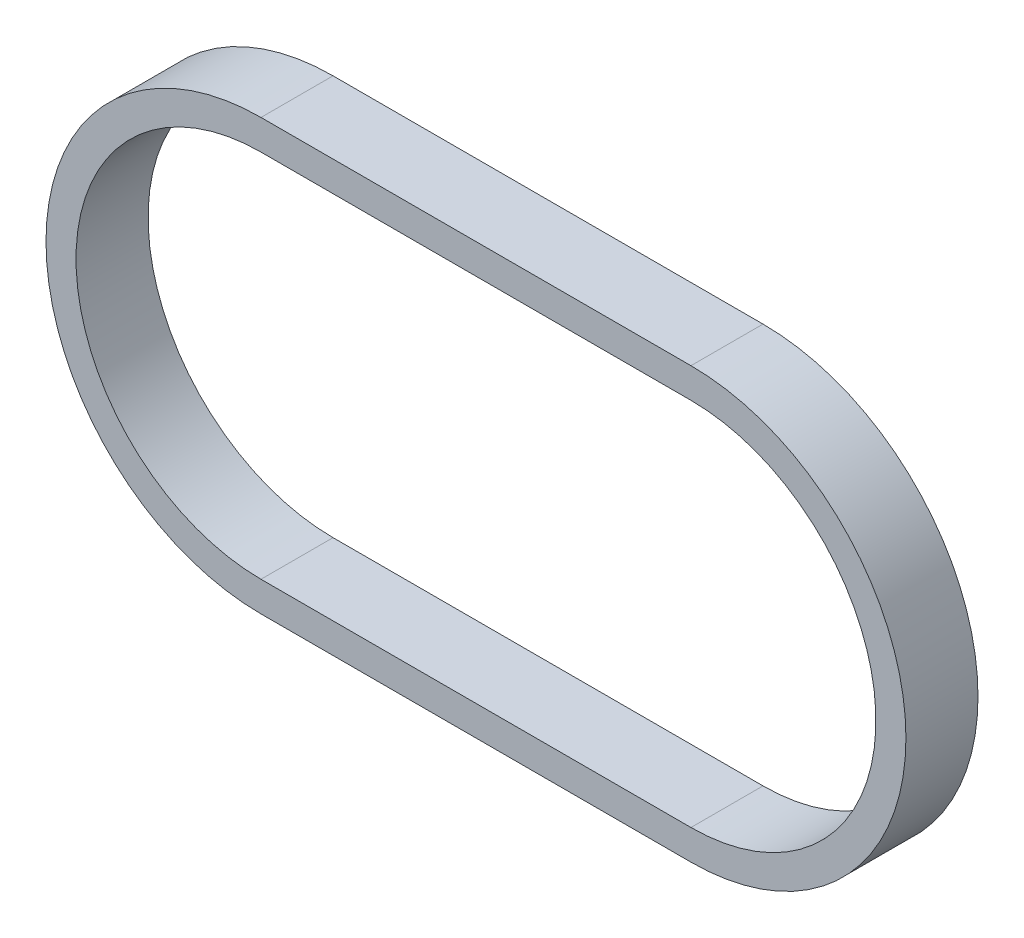
ISO-10303-21;
HEADER;
FILE_DESCRIPTION(('STEP AP214'),'2;1');
FILE_NAME('part.step','',(''),(''),'','','');
FILE_SCHEMA(('AUTOMOTIVE_DESIGN { 1 0 10303 214 1 1 1 1 }'));
ENDSEC;
DATA;
#1=APPLICATION_CONTEXT('core data for automotive mechanical design processes');
#2=APPLICATION_PROTOCOL_DEFINITION('international standard','automotive_design',2000,#1);
#3=PRODUCT_CONTEXT('',#1,'mechanical');
#4=PRODUCT('Part','Part','',(#3));
#5=PRODUCT_RELATED_PRODUCT_CATEGORY('part','',(#4));
#6=PRODUCT_DEFINITION_FORMATION('','',#4);
#7=PRODUCT_DEFINITION_CONTEXT('part definition',#1,'design');
#8=PRODUCT_DEFINITION('design','',#6,#7);
#9=PRODUCT_DEFINITION_SHAPE('','',#8);
#10=(LENGTH_UNIT() NAMED_UNIT(*) SI_UNIT(.MILLI.,.METRE.));
#11=(NAMED_UNIT(*) PLANE_ANGLE_UNIT() SI_UNIT($,.RADIAN.));
#12=(NAMED_UNIT(*) SI_UNIT($,.STERADIAN.) SOLID_ANGLE_UNIT());
#13=UNCERTAINTY_MEASURE_WITH_UNIT(LENGTH_MEASURE(1.E-05),#10,'distance_accuracy_value','');
#14=(GEOMETRIC_REPRESENTATION_CONTEXT(3) GLOBAL_UNCERTAINTY_ASSIGNED_CONTEXT((#13)) GLOBAL_UNIT_ASSIGNED_CONTEXT((#10,
#11,#12)) REPRESENTATION_CONTEXT('',''));
#15=CARTESIAN_POINT('',(0.,0.,0.));
#16=DIRECTION('',(0.,0.,1.));
#17=DIRECTION('',(1.,0.,0.));
#18=AXIS2_PLACEMENT_3D('',#15,#16,#17);
#19=CARTESIAN_POINT('',(-17.9,0.,6.));
#20=DIRECTION('',(0.,0.,1.));
#21=DIRECTION('',(1.,0.,0.));
#22=AXIS2_PLACEMENT_3D('',#19,#20,#21);
#23=PLANE('',#22);
#24=CARTESIAN_POINT('',(-17.9,0.,6.));
#25=DIRECTION('',(0.,0.,1.));
#26=DIRECTION('',(1.,0.,0.));
#27=AXIS2_PLACEMENT_3D('',#24,#25,#26);
#28=CIRCLE('',#27,17.9);
#29=CARTESIAN_POINT('',(-17.9,17.9,6.));
#30=VERTEX_POINT('',#29);
#31=CARTESIAN_POINT('',(-17.9,-17.9,6.));
#32=VERTEX_POINT('',#31);
#33=EDGE_CURVE('E138',#30,#32,#28,.T.);
#34=ORIENTED_EDGE('',*,*,#33,.T.);
#35=DIRECTION('',(1.,0.,0.));
#36=VECTOR('',#35,1.);
#37=CARTESIAN_POINT('',(-17.9,-17.9,6.));
#38=LINE('',#37,#36);
#39=CARTESIAN_POINT('',(17.9,-17.9,6.));
#40=VERTEX_POINT('',#39);
#41=EDGE_CURVE('E141',#32,#40,#38,.T.);
#42=ORIENTED_EDGE('',*,*,#41,.T.);
#43=CARTESIAN_POINT('',(17.9,0.,6.));
#44=DIRECTION('',(0.,0.,1.));
#45=DIRECTION('',(1.,0.,0.));
#46=AXIS2_PLACEMENT_3D('',#43,#44,#45);
#47=CIRCLE('',#46,17.9);
#48=CARTESIAN_POINT('',(17.9,17.9,6.));
#49=VERTEX_POINT('',#48);
#50=EDGE_CURVE('E144',#40,#49,#47,.T.);
#51=ORIENTED_EDGE('',*,*,#50,.T.);
#52=DIRECTION('',(-1.,0.,0.));
#53=VECTOR('',#52,1.);
#54=CARTESIAN_POINT('',(17.9,17.9,6.));
#55=LINE('',#54,#53);
#56=EDGE_CURVE('E146',#49,#30,#55,.T.);
#57=ORIENTED_EDGE('',*,*,#56,.T.);
#58=EDGE_LOOP('',(#34,#42,#51,#57));
#59=FACE_BOUND('',#58,.T.);
#60=DIRECTION('',(-1.,0.,0.));
#61=VECTOR('',#60,1.);
#62=CARTESIAN_POINT('',(-17.9,15.4,6.));
#63=LINE('',#62,#61);
#64=CARTESIAN_POINT('',(17.9,15.4,6.));
#65=VERTEX_POINT('',#64);
#66=CARTESIAN_POINT('',(-17.9,15.4,6.));
#67=VERTEX_POINT('',#66);
#68=EDGE_CURVE('E110',#65,#67,#63,.T.);
#69=ORIENTED_EDGE('',*,*,#68,.F.);
#70=CARTESIAN_POINT('',(17.9,0.,6.));
#71=DIRECTION('',(0.,0.,1.));
#72=DIRECTION('',(-1.,0.,0.));
#73=AXIS2_PLACEMENT_3D('',#70,#71,#72);
#74=CIRCLE('',#73,15.4);
#75=CARTESIAN_POINT('',(17.9,-15.4,6.));
#76=VERTEX_POINT('',#75);
#77=EDGE_CURVE('E102',#76,#65,#74,.T.);
#78=ORIENTED_EDGE('',*,*,#77,.F.);
#79=DIRECTION('',(1.,0.,0.));
#80=VECTOR('',#79,1.);
#81=CARTESIAN_POINT('',(17.9,-15.4,6.));
#82=LINE('',#81,#80);
#83=CARTESIAN_POINT('',(-17.9,-15.4,6.));
#84=VERTEX_POINT('',#83);
#85=EDGE_CURVE('E124',#84,#76,#82,.T.);
#86=ORIENTED_EDGE('',*,*,#85,.F.);
#87=CARTESIAN_POINT('',(-17.9,0.,6.));
#88=DIRECTION('',(0.,0.,1.));
#89=DIRECTION('',(-1.,0.,0.));
#90=AXIS2_PLACEMENT_3D('',#87,#88,#89);
#91=CIRCLE('',#90,15.4);
#92=EDGE_CURVE('E122',#67,#84,#91,.T.);
#93=ORIENTED_EDGE('',*,*,#92,.F.);
#94=EDGE_LOOP('',(#69,#78,#86,#93));
#95=FACE_BOUND('',#94,.T.);
#96=ADVANCED_FACE('F37',(#59,#95),#23,.T.);
#97=CARTESIAN_POINT('',(-17.9,0.,0.));
#98=DIRECTION('',(0.,0.,1.));
#99=DIRECTION('',(1.,0.,0.));
#100=AXIS2_PLACEMENT_3D('',#97,#98,#99);
#101=PLANE('',#100);
#102=CARTESIAN_POINT('',(-17.9,0.,0.));
#103=DIRECTION('',(0.,0.,1.));
#104=DIRECTION('',(1.,0.,0.));
#105=AXIS2_PLACEMENT_3D('',#102,#103,#104);
#106=CIRCLE('',#105,17.9);
#107=CARTESIAN_POINT('',(-17.9,17.9,0.));
#108=VERTEX_POINT('',#107);
#109=CARTESIAN_POINT('',(-17.9,-17.9,0.));
#110=VERTEX_POINT('',#109);
#111=EDGE_CURVE('E118',#108,#110,#106,.T.);
#112=ORIENTED_EDGE('',*,*,#111,.F.);
#113=DIRECTION('',(-1.,0.,0.));
#114=VECTOR('',#113,1.);
#115=CARTESIAN_POINT('',(17.9,17.9,0.));
#116=LINE('',#115,#114);
#117=CARTESIAN_POINT('',(17.9,17.9,0.));
#118=VERTEX_POINT('',#117);
#119=EDGE_CURVE('E142',#118,#108,#116,.T.);
#120=ORIENTED_EDGE('',*,*,#119,.F.);
#121=CARTESIAN_POINT('',(17.9,0.,0.));
#122=DIRECTION('',(0.,0.,1.));
#123=DIRECTION('',(1.,0.,0.));
#124=AXIS2_PLACEMENT_3D('',#121,#122,#123);
#125=CIRCLE('',#124,17.9);
#126=CARTESIAN_POINT('',(17.9,-17.9,0.));
#127=VERTEX_POINT('',#126);
#128=EDGE_CURVE('E153',#127,#118,#125,.T.);
#129=ORIENTED_EDGE('',*,*,#128,.F.);
#130=DIRECTION('',(1.,0.,0.));
#131=VECTOR('',#130,1.);
#132=CARTESIAN_POINT('',(-17.9,-17.9,0.));
#133=LINE('',#132,#131);
#134=EDGE_CURVE('E151',#110,#127,#133,.T.);
#135=ORIENTED_EDGE('',*,*,#134,.F.);
#136=EDGE_LOOP('',(#112,#120,#129,#135));
#137=FACE_BOUND('',#136,.T.);
#138=CARTESIAN_POINT('',(17.9,0.,0.));
#139=DIRECTION('',(0.,0.,1.));
#140=DIRECTION('',(-1.,0.,0.));
#141=AXIS2_PLACEMENT_3D('',#138,#139,#140);
#142=CIRCLE('',#141,15.4);
#143=CARTESIAN_POINT('',(17.9,-15.4,0.));
#144=VERTEX_POINT('',#143);
#145=CARTESIAN_POINT('',(17.9,15.4,0.));
#146=VERTEX_POINT('',#145);
#147=EDGE_CURVE('E60',#144,#146,#142,.T.);
#148=ORIENTED_EDGE('',*,*,#147,.T.);
#149=DIRECTION('',(-1.,0.,0.));
#150=VECTOR('',#149,1.);
#151=CARTESIAN_POINT('',(-17.9,15.4,0.));
#152=LINE('',#151,#150);
#153=CARTESIAN_POINT('',(-17.9,15.4,0.));
#154=VERTEX_POINT('',#153);
#155=EDGE_CURVE('E117',#146,#154,#152,.T.);
#156=ORIENTED_EDGE('',*,*,#155,.T.);
#157=CARTESIAN_POINT('',(-17.9,0.,0.));
#158=DIRECTION('',(0.,0.,1.));
#159=DIRECTION('',(-1.,0.,0.));
#160=AXIS2_PLACEMENT_3D('',#157,#158,#159);
#161=CIRCLE('',#160,15.4);
#162=CARTESIAN_POINT('',(-17.9,-15.4,0.));
#163=VERTEX_POINT('',#162);
#164=EDGE_CURVE('E130',#154,#163,#161,.T.);
#165=ORIENTED_EDGE('',*,*,#164,.T.);
#166=DIRECTION('',(1.,0.,0.));
#167=VECTOR('',#166,1.);
#168=CARTESIAN_POINT('',(17.9,-15.4,0.));
#169=LINE('',#168,#167);
#170=EDGE_CURVE('E111',#163,#144,#169,.T.);
#171=ORIENTED_EDGE('',*,*,#170,.T.);
#172=EDGE_LOOP('',(#148,#156,#165,#171));
#173=FACE_BOUND('',#172,.T.);
#174=ADVANCED_FACE('F171',(#137,#173),#101,.F.);
#175=CARTESIAN_POINT('',(-17.9,0.,6.));
#176=DIRECTION('',(0.,0.,-1.));
#177=DIRECTION('',(-1.,0.,0.));
#178=AXIS2_PLACEMENT_3D('',#175,#176,#177);
#179=CYLINDRICAL_SURFACE('',#178,17.9);
#180=ORIENTED_EDGE('',*,*,#111,.T.);
#181=DIRECTION('',(0.,0.,-1.));
#182=VECTOR('',#181,1.);
#183=CARTESIAN_POINT('',(-17.9,-17.9,6.));
#184=LINE('',#183,#182);
#185=EDGE_CURVE('E11',#32,#110,#184,.T.);
#186=ORIENTED_EDGE('',*,*,#185,.F.);
#187=ORIENTED_EDGE('',*,*,#33,.F.);
#188=DIRECTION('',(0.,0.,-1.));
#189=VECTOR('',#188,1.);
#190=CARTESIAN_POINT('',(-17.9,17.9,6.));
#191=LINE('',#190,#189);
#192=EDGE_CURVE('E148',#30,#108,#191,.T.);
#193=ORIENTED_EDGE('',*,*,#192,.T.);
#194=EDGE_LOOP('',(#180,#186,#187,#193));
#195=FACE_BOUND('',#194,.T.);
#196=ADVANCED_FACE('F39',(#195),#179,.T.);
#197=CARTESIAN_POINT('',(-17.9,-17.9,6.));
#198=DIRECTION('',(0.,1.,0.));
#199=DIRECTION('',(0.,0.,1.));
#200=AXIS2_PLACEMENT_3D('',#197,#198,#199);
#201=PLANE('',#200);
#202=ORIENTED_EDGE('',*,*,#134,.T.);
#203=DIRECTION('',(0.,0.,-1.));
#204=VECTOR('',#203,1.);
#205=CARTESIAN_POINT('',(17.9,-17.9,6.));
#206=LINE('',#205,#204);
#207=EDGE_CURVE('E45',#40,#127,#206,.T.);
#208=ORIENTED_EDGE('',*,*,#207,.F.);
#209=ORIENTED_EDGE('',*,*,#41,.F.);
#210=ORIENTED_EDGE('',*,*,#185,.T.);
#211=EDGE_LOOP('',(#202,#208,#209,#210));
#212=FACE_BOUND('',#211,.T.);
#213=ADVANCED_FACE('F181',(#212),#201,.F.);
#214=CARTESIAN_POINT('',(17.9,0.,6.));
#215=DIRECTION('',(0.,0.,-1.));
#216=DIRECTION('',(-1.,0.,0.));
#217=AXIS2_PLACEMENT_3D('',#214,#215,#216);
#218=CYLINDRICAL_SURFACE('',#217,17.9);
#219=ORIENTED_EDGE('',*,*,#128,.T.);
#220=DIRECTION('',(0.,0.,-1.));
#221=VECTOR('',#220,1.);
#222=CARTESIAN_POINT('',(17.9,17.9,6.));
#223=LINE('',#222,#221);
#224=EDGE_CURVE('E158',#49,#118,#223,.T.);
#225=ORIENTED_EDGE('',*,*,#224,.F.);
#226=ORIENTED_EDGE('',*,*,#50,.F.);
#227=ORIENTED_EDGE('',*,*,#207,.T.);
#228=EDGE_LOOP('',(#219,#225,#226,#227));
#229=FACE_BOUND('',#228,.T.);
#230=ADVANCED_FACE('F165',(#229),#218,.T.);
#231=CARTESIAN_POINT('',(17.9,17.9,6.));
#232=DIRECTION('',(0.,-1.,0.));
#233=DIRECTION('',(0.,0.,-1.));
#234=AXIS2_PLACEMENT_3D('',#231,#232,#233);
#235=PLANE('',#234);
#236=ORIENTED_EDGE('',*,*,#119,.T.);
#237=ORIENTED_EDGE('',*,*,#192,.F.);
#238=ORIENTED_EDGE('',*,*,#56,.F.);
#239=ORIENTED_EDGE('',*,*,#224,.T.);
#240=EDGE_LOOP('',(#236,#237,#238,#239));
#241=FACE_BOUND('',#240,.T.);
#242=ADVANCED_FACE('F175',(#241),#235,.F.);
#243=CARTESIAN_POINT('',(17.9,0.,6.));
#244=DIRECTION('',(0.,0.,-1.));
#245=DIRECTION('',(-1.,0.,0.));
#246=AXIS2_PLACEMENT_3D('',#243,#244,#245);
#247=CYLINDRICAL_SURFACE('',#246,15.4);
#248=ORIENTED_EDGE('',*,*,#147,.F.);
#249=DIRECTION('',(0.,0.,-1.));
#250=VECTOR('',#249,1.);
#251=CARTESIAN_POINT('',(17.9,-15.4,6.));
#252=LINE('',#251,#250);
#253=EDGE_CURVE('E106',#76,#144,#252,.T.);
#254=ORIENTED_EDGE('',*,*,#253,.F.);
#255=ORIENTED_EDGE('',*,*,#77,.T.);
#256=DIRECTION('',(0.,0.,-1.));
#257=VECTOR('',#256,1.);
#258=CARTESIAN_POINT('',(17.9,15.4,6.));
#259=LINE('',#258,#257);
#260=EDGE_CURVE('E105',#65,#146,#259,.T.);
#261=ORIENTED_EDGE('',*,*,#260,.T.);
#262=EDGE_LOOP('',(#248,#254,#255,#261));
#263=FACE_BOUND('',#262,.T.);
#264=ADVANCED_FACE('F104',(#263),#247,.F.);
#265=CARTESIAN_POINT('',(-17.9,15.4,6.));
#266=DIRECTION('',(0.,-1.,0.));
#267=DIRECTION('',(1.,0.,0.));
#268=AXIS2_PLACEMENT_3D('',#265,#266,#267);
#269=PLANE('',#268);
#270=ORIENTED_EDGE('',*,*,#155,.F.);
#271=ORIENTED_EDGE('',*,*,#260,.F.);
#272=ORIENTED_EDGE('',*,*,#68,.T.);
#273=DIRECTION('',(0.,0.,-1.));
#274=VECTOR('',#273,1.);
#275=CARTESIAN_POINT('',(-17.9,15.4,6.));
#276=LINE('',#275,#274);
#277=EDGE_CURVE('E119',#67,#154,#276,.T.);
#278=ORIENTED_EDGE('',*,*,#277,.T.);
#279=EDGE_LOOP('',(#270,#271,#272,#278));
#280=FACE_BOUND('',#279,.T.);
#281=ADVANCED_FACE('F114',(#280),#269,.T.);
#282=CARTESIAN_POINT('',(-17.9,0.,6.));
#283=DIRECTION('',(0.,0.,-1.));
#284=DIRECTION('',(-1.,0.,0.));
#285=AXIS2_PLACEMENT_3D('',#282,#283,#284);
#286=CYLINDRICAL_SURFACE('',#285,15.4);
#287=ORIENTED_EDGE('',*,*,#164,.F.);
#288=ORIENTED_EDGE('',*,*,#277,.F.);
#289=ORIENTED_EDGE('',*,*,#92,.T.);
#290=DIRECTION('',(0.,0.,-1.));
#291=VECTOR('',#290,1.);
#292=CARTESIAN_POINT('',(-17.9,-15.4,6.));
#293=LINE('',#292,#291);
#294=EDGE_CURVE('E52',#84,#163,#293,.T.);
#295=ORIENTED_EDGE('',*,*,#294,.T.);
#296=EDGE_LOOP('',(#287,#288,#289,#295));
#297=FACE_BOUND('',#296,.T.);
#298=ADVANCED_FACE('F204',(#297),#286,.F.);
#299=CARTESIAN_POINT('',(17.9,-15.4,6.));
#300=DIRECTION('',(0.,1.,0.));
#301=DIRECTION('',(-1.,0.,0.));
#302=AXIS2_PLACEMENT_3D('',#299,#300,#301);
#303=PLANE('',#302);
#304=ORIENTED_EDGE('',*,*,#170,.F.);
#305=ORIENTED_EDGE('',*,*,#294,.F.);
#306=ORIENTED_EDGE('',*,*,#85,.T.);
#307=ORIENTED_EDGE('',*,*,#253,.T.);
#308=EDGE_LOOP('',(#304,#305,#306,#307));
#309=FACE_BOUND('',#308,.T.);
#310=ADVANCED_FACE('F208',(#309),#303,.T.);
#311=CLOSED_SHELL('',(#96,#174,#196,#213,#230,#242,#264,#281,#298,#310));
#312=MANIFOLD_SOLID_BREP('B2',#311);
#313=ADVANCED_BREP_SHAPE_REPRESENTATION('',(#18,#312),#14);
#314=SHAPE_DEFINITION_REPRESENTATION(#9,#313);
ENDSEC;
END-ISO-10303-21;
